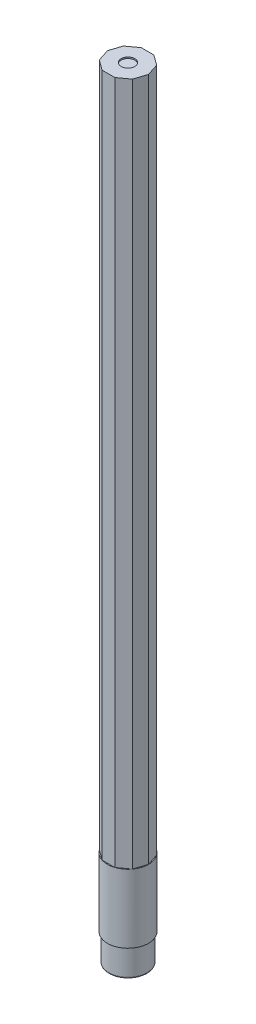
ISO-10303-21;
HEADER;
FILE_DESCRIPTION(('STEP AP214'),'2;1');
FILE_NAME('part.step','',(''),(''),'','','');
FILE_SCHEMA(('AUTOMOTIVE_DESIGN { 1 0 10303 214 1 1 1 1 }'));
ENDSEC;
DATA;
#1=APPLICATION_CONTEXT('core data for automotive mechanical design processes');
#2=APPLICATION_PROTOCOL_DEFINITION('international standard','automotive_design',2000,#1);
#3=PRODUCT_CONTEXT('',#1,'mechanical');
#4=PRODUCT('Part','Part','',(#3));
#5=PRODUCT_RELATED_PRODUCT_CATEGORY('part','',(#4));
#6=PRODUCT_DEFINITION_FORMATION('','',#4);
#7=PRODUCT_DEFINITION_CONTEXT('part definition',#1,'design');
#8=PRODUCT_DEFINITION('design','',#6,#7);
#9=PRODUCT_DEFINITION_SHAPE('','',#8);
#10=(LENGTH_UNIT() NAMED_UNIT(*) SI_UNIT(.MILLI.,.METRE.));
#11=(NAMED_UNIT(*) PLANE_ANGLE_UNIT() SI_UNIT($,.RADIAN.));
#12=(NAMED_UNIT(*) SI_UNIT($,.STERADIAN.) SOLID_ANGLE_UNIT());
#13=UNCERTAINTY_MEASURE_WITH_UNIT(LENGTH_MEASURE(1.E-05),#10,'distance_accuracy_value','');
#14=(GEOMETRIC_REPRESENTATION_CONTEXT(3) GLOBAL_UNCERTAINTY_ASSIGNED_CONTEXT((#13)) GLOBAL_UNIT_ASSIGNED_CONTEXT((#10,
#11,#12)) REPRESENTATION_CONTEXT('',''));
#15=CARTESIAN_POINT('',(0.,0.,0.));
#16=DIRECTION('',(0.,0.,1.));
#17=DIRECTION('',(1.,0.,0.));
#18=AXIS2_PLACEMENT_3D('',#15,#16,#17);
#19=CARTESIAN_POINT('',(0.,12.7,0.));
#20=DIRECTION('',(0.,1.,0.));
#21=DIRECTION('',(0.,0.,1.));
#22=AXIS2_PLACEMENT_3D('',#19,#20,#21);
#23=PLANE('',#22);
#24=DIRECTION('',(0.309016994374951,0.,-0.951056516295153));
#25=VECTOR('',#24,1.);
#26=CARTESIAN_POINT('',(3.08235474856854,12.7,2.23946181123433));
#27=LINE('',#26,#25);
#28=CARTESIAN_POINT('',(3.08235474856854,12.7,2.23946181123433));
#29=VERTEX_POINT('',#28);
#30=CARTESIAN_POINT('',(3.81,12.7,0.));
#31=VERTEX_POINT('',#30);
#32=EDGE_CURVE('E144',#29,#31,#27,.T.);
#33=ORIENTED_EDGE('',*,*,#32,.F.);
#34=CARTESIAN_POINT('',(0.,12.7,0.));
#35=DIRECTION('',(0.,1.,0.));
#36=DIRECTION('',(0.,0.,1.));
#37=AXIS2_PLACEMENT_3D('',#34,#35,#36);
#38=CIRCLE('',#37,3.81);
#39=EDGE_CURVE('E157',#29,#31,#38,.T.);
#40=ORIENTED_EDGE('',*,*,#39,.T.);
#41=EDGE_LOOP('',(#33,#40));
#42=FACE_BOUND('',#41,.T.);
#43=ADVANCED_FACE('F41',(#42),#23,.T.);
#44=DIRECTION('',(0.80901699437495,0.,-0.587785252292469));
#45=VECTOR('',#44,1.);
#46=CARTESIAN_POINT('',(1.17735474856854,12.7,3.62352532708453));
#47=LINE('',#46,#45);
#48=CARTESIAN_POINT('',(1.17735474856855,12.7,3.62352532708453));
#49=VERTEX_POINT('',#48);
#50=EDGE_CURVE('E141',#49,#29,#47,.T.);
#51=ORIENTED_EDGE('',*,*,#50,.F.);
#52=EDGE_CURVE('E154',#49,#29,#38,.T.);
#53=ORIENTED_EDGE('',*,*,#52,.T.);
#54=EDGE_LOOP('',(#51,#53));
#55=FACE_BOUND('',#54,.T.);
#56=ADVANCED_FACE('F252',(#55),#23,.T.);
#57=DIRECTION('',(1.,0.,0.));
#58=VECTOR('',#57,1.);
#59=CARTESIAN_POINT('',(-1.17735474856856,12.7,3.62352532708453));
#60=LINE('',#59,#58);
#61=CARTESIAN_POINT('',(-1.17735474856855,12.7,3.62352532708453));
#62=VERTEX_POINT('',#61);
#63=EDGE_CURVE('E55',#62,#49,#60,.T.);
#64=ORIENTED_EDGE('',*,*,#63,.F.);
#65=EDGE_CURVE('E148',#62,#49,#38,.T.);
#66=ORIENTED_EDGE('',*,*,#65,.T.);
#67=EDGE_LOOP('',(#64,#66));
#68=FACE_BOUND('',#67,.T.);
#69=ADVANCED_FACE('F257',(#68),#23,.T.);
#70=DIRECTION('',(0.809016994374947,0.,0.587785252292474));
#71=VECTOR('',#70,1.);
#72=CARTESIAN_POINT('',(-3.08235474856856,12.7,2.23946181123431));
#73=LINE('',#72,#71);
#74=CARTESIAN_POINT('',(-3.08235474856856,12.7,2.23946181123431));
#75=VERTEX_POINT('',#74);
#76=EDGE_CURVE('E62',#75,#62,#73,.T.);
#77=ORIENTED_EDGE('',*,*,#76,.F.);
#78=EDGE_CURVE('E291',#75,#62,#38,.T.);
#79=ORIENTED_EDGE('',*,*,#78,.T.);
#80=EDGE_LOOP('',(#77,#79));
#81=FACE_BOUND('',#80,.T.);
#82=ADVANCED_FACE('F503',(#81),#23,.T.);
#83=DIRECTION('',(0.309016994374945,0.,0.951056516295155));
#84=VECTOR('',#83,1.);
#85=CARTESIAN_POINT('',(-3.81,12.7,0.));
#86=LINE('',#85,#84);
#87=CARTESIAN_POINT('',(-3.81,12.7,0.));
#88=VERTEX_POINT('',#87);
#89=EDGE_CURVE('E200',#88,#75,#86,.T.);
#90=ORIENTED_EDGE('',*,*,#89,.F.);
#91=EDGE_CURVE('E288',#88,#75,#38,.T.);
#92=ORIENTED_EDGE('',*,*,#91,.T.);
#93=EDGE_LOOP('',(#90,#92));
#94=FACE_BOUND('',#93,.T.);
#95=ADVANCED_FACE('F512',(#94),#23,.T.);
#96=DIRECTION('',(-0.30901699437495,0.,0.951056516295153));
#97=VECTOR('',#96,1.);
#98=CARTESIAN_POINT('',(-3.08235474856854,12.7,-2.23946181123433));
#99=LINE('',#98,#97);
#100=CARTESIAN_POINT('',(-3.08235474856854,12.7,-2.23946181123433));
#101=VERTEX_POINT('',#100);
#102=EDGE_CURVE('E197',#101,#88,#99,.T.);
#103=ORIENTED_EDGE('',*,*,#102,.F.);
#104=EDGE_CURVE('E286',#101,#88,#38,.T.);
#105=ORIENTED_EDGE('',*,*,#104,.T.);
#106=EDGE_LOOP('',(#103,#105));
#107=FACE_BOUND('',#106,.T.);
#108=ADVANCED_FACE('F278',(#107),#23,.T.);
#109=DIRECTION('',(-0.80901699437495,0.,0.587785252292469));
#110=VECTOR('',#109,1.);
#111=CARTESIAN_POINT('',(-1.17735474856854,12.7,-3.62352532708453));
#112=LINE('',#111,#110);
#113=CARTESIAN_POINT('',(-1.17735474856855,12.7,-3.62352532708453));
#114=VERTEX_POINT('',#113);
#115=EDGE_CURVE('E194',#114,#101,#112,.T.);
#116=ORIENTED_EDGE('',*,*,#115,.F.);
#117=EDGE_CURVE('E285',#114,#101,#38,.T.);
#118=ORIENTED_EDGE('',*,*,#117,.T.);
#119=EDGE_LOOP('',(#116,#118));
#120=FACE_BOUND('',#119,.T.);
#121=ADVANCED_FACE('F273',(#120),#23,.T.);
#122=DIRECTION('',(-1.,0.,0.));
#123=VECTOR('',#122,1.);
#124=CARTESIAN_POINT('',(1.17735474856856,12.7,-3.62352532708453));
#125=LINE('',#124,#123);
#126=CARTESIAN_POINT('',(1.17735474856855,12.7,-3.62352532708453));
#127=VERTEX_POINT('',#126);
#128=EDGE_CURVE('E191',#127,#114,#125,.T.);
#129=ORIENTED_EDGE('',*,*,#128,.F.);
#130=EDGE_CURVE('E281',#127,#114,#38,.T.);
#131=ORIENTED_EDGE('',*,*,#130,.T.);
#132=EDGE_LOOP('',(#129,#131));
#133=FACE_BOUND('',#132,.T.);
#134=ADVANCED_FACE('F269',(#133),#23,.T.);
#135=DIRECTION('',(-0.809016994374946,0.,-0.587785252292475));
#136=VECTOR('',#135,1.);
#137=CARTESIAN_POINT('',(3.08235474856856,12.7,-2.23946181123431));
#138=LINE('',#137,#136);
#139=CARTESIAN_POINT('',(3.08235474856856,12.7,-2.23946181123431));
#140=VERTEX_POINT('',#139);
#141=EDGE_CURVE('E188',#140,#127,#138,.T.);
#142=ORIENTED_EDGE('',*,*,#141,.F.);
#143=EDGE_CURVE('E238',#140,#127,#38,.T.);
#144=ORIENTED_EDGE('',*,*,#143,.T.);
#145=EDGE_LOOP('',(#142,#144));
#146=FACE_BOUND('',#145,.T.);
#147=ADVANCED_FACE('F236',(#146),#23,.T.);
#148=CARTESIAN_POINT('',(0.,12.7,0.));
#149=DIRECTION('',(0.,-1.,0.));
#150=DIRECTION('',(0.,0.,-1.));
#151=AXIS2_PLACEMENT_3D('',#148,#149,#150);
#152=CYLINDRICAL_SURFACE('',#151,3.81);
#153=ORIENTED_EDGE('',*,*,#52,.F.);
#154=ORIENTED_EDGE('',*,*,#65,.F.);
#155=ORIENTED_EDGE('',*,*,#78,.F.);
#156=ORIENTED_EDGE('',*,*,#91,.F.);
#157=ORIENTED_EDGE('',*,*,#104,.F.);
#158=ORIENTED_EDGE('',*,*,#117,.F.);
#159=ORIENTED_EDGE('',*,*,#130,.F.);
#160=ORIENTED_EDGE('',*,*,#143,.F.);
#161=EDGE_CURVE('E242',#31,#140,#38,.T.);
#162=ORIENTED_EDGE('',*,*,#161,.F.);
#163=ORIENTED_EDGE('',*,*,#39,.F.);
#164=EDGE_LOOP('',(#153,#154,#155,#156,#157,#158,#159,#160,#162,#163));
#165=FACE_BOUND('',#164,.T.);
#166=CARTESIAN_POINT('',(0.,0.,0.));
#167=DIRECTION('',(0.,1.,0.));
#168=DIRECTION('',(0.,0.,1.));
#169=AXIS2_PLACEMENT_3D('',#166,#167,#168);
#170=CIRCLE('',#169,3.81);
#171=CARTESIAN_POINT('',(0.,0.,3.81));
#172=VERTEX_POINT('',#171);
#173=EDGE_CURVE('E145',#172,#172,#170,.T.);
#174=ORIENTED_EDGE('',*,*,#173,.T.);
#175=EDGE_LOOP('',(#174));
#176=FACE_BOUND('',#175,.T.);
#177=ADVANCED_FACE('F247',(#165,#176),#152,.T.);
#178=DIRECTION('',(-0.309016994374944,0.,-0.951056516295155));
#179=VECTOR('',#178,1.);
#180=CARTESIAN_POINT('',(3.81,12.7,0.));
#181=LINE('',#180,#179);
#182=EDGE_CURVE('E185',#31,#140,#181,.T.);
#183=ORIENTED_EDGE('',*,*,#182,.F.);
#184=ORIENTED_EDGE('',*,*,#161,.T.);
#185=EDGE_LOOP('',(#183,#184));
#186=FACE_BOUND('',#185,.T.);
#187=ADVANCED_FACE('F241',(#186),#23,.T.);
#188=CARTESIAN_POINT('',(0.,0.,0.));
#189=DIRECTION('',(0.,1.,0.));
#190=DIRECTION('',(0.,0.,1.));
#191=AXIS2_PLACEMENT_3D('',#188,#189,#190);
#192=PLANE('',#191);
#193=CARTESIAN_POINT('',(0.,0.,0.));
#194=DIRECTION('',(0.,-1.,0.));
#195=DIRECTION('',(0.,0.,-1.));
#196=AXIS2_PLACEMENT_3D('',#193,#194,#195);
#197=CIRCLE('',#196,3.556);
#198=CARTESIAN_POINT('',(0.,0.,-3.556));
#199=VERTEX_POINT('',#198);
#200=EDGE_CURVE('E156',#199,#199,#197,.T.);
#201=ORIENTED_EDGE('',*,*,#200,.F.);
#202=EDGE_LOOP('',(#201));
#203=FACE_BOUND('',#202,.T.);
#204=ORIENTED_EDGE('',*,*,#173,.F.);
#205=EDGE_LOOP('',(#204));
#206=FACE_BOUND('',#205,.T.);
#207=ADVANCED_FACE('F262',(#203,#206),#192,.F.);
#208=CARTESIAN_POINT('',(3.08235474856854,139.7,2.23946181123433));
#209=DIRECTION('',(-0.951056516295153,0.,-0.309016994374951));
#210=DIRECTION('',(-0.309016994374951,0.,0.951056516295153));
#211=AXIS2_PLACEMENT_3D('',#208,#209,#210);
#212=PLANE('',#211);
#213=ORIENTED_EDGE('',*,*,#32,.T.);
#214=DIRECTION('',(0.,-1.,0.));
#215=VECTOR('',#214,1.);
#216=CARTESIAN_POINT('',(3.81,139.7,0.));
#217=LINE('',#216,#215);
#218=CARTESIAN_POINT('',(3.81,139.7,0.));
#219=VERTEX_POINT('',#218);
#220=EDGE_CURVE('E125',#219,#31,#217,.T.);
#221=ORIENTED_EDGE('',*,*,#220,.F.);
#222=DIRECTION('',(0.309016994374951,0.,-0.951056516295153));
#223=VECTOR('',#222,1.);
#224=CARTESIAN_POINT('',(3.08235474856854,139.7,2.23946181123433));
#225=LINE('',#224,#223);
#226=CARTESIAN_POINT('',(3.08235474856854,139.7,2.23946181123433));
#227=VERTEX_POINT('',#226);
#228=EDGE_CURVE('E132',#227,#219,#225,.T.);
#229=ORIENTED_EDGE('',*,*,#228,.F.);
#230=DIRECTION('',(0.,-1.,0.));
#231=VECTOR('',#230,1.);
#232=CARTESIAN_POINT('',(3.08235474856854,139.7,2.23946181123433));
#233=LINE('',#232,#231);
#234=EDGE_CURVE('E183',#227,#29,#233,.T.);
#235=ORIENTED_EDGE('',*,*,#234,.T.);
#236=EDGE_LOOP('',(#213,#221,#229,#235));
#237=FACE_BOUND('',#236,.T.);
#238=ADVANCED_FACE('F143',(#237),#212,.F.);
#239=CARTESIAN_POINT('',(3.81,139.7,0.));
#240=DIRECTION('',(-0.951056516295155,0.,0.309016994374944));
#241=DIRECTION('',(0.309016994374944,0.,0.951056516295155));
#242=AXIS2_PLACEMENT_3D('',#239,#240,#241);
#243=PLANE('',#242);
#244=ORIENTED_EDGE('',*,*,#182,.T.);
#245=DIRECTION('',(0.,-1.,0.));
#246=VECTOR('',#245,1.);
#247=CARTESIAN_POINT('',(3.08235474856856,139.7,-2.23946181123431));
#248=LINE('',#247,#246);
#249=CARTESIAN_POINT('',(3.08235474856856,139.7,-2.23946181123431));
#250=VERTEX_POINT('',#249);
#251=EDGE_CURVE('E128',#250,#140,#248,.T.);
#252=ORIENTED_EDGE('',*,*,#251,.F.);
#253=DIRECTION('',(-0.309016994374944,0.,-0.951056516295155));
#254=VECTOR('',#253,1.);
#255=CARTESIAN_POINT('',(3.81,139.7,0.));
#256=LINE('',#255,#254);
#257=EDGE_CURVE('E120',#219,#250,#256,.T.);
#258=ORIENTED_EDGE('',*,*,#257,.F.);
#259=ORIENTED_EDGE('',*,*,#220,.T.);
#260=EDGE_LOOP('',(#244,#252,#258,#259));
#261=FACE_BOUND('',#260,.T.);
#262=ADVANCED_FACE('F123',(#261),#243,.F.);
#263=CARTESIAN_POINT('',(3.08235474856856,139.7,-2.23946181123431));
#264=DIRECTION('',(-0.587785252292475,0.,0.809016994374946));
#265=DIRECTION('',(0.809016994374946,0.,0.587785252292475));
#266=AXIS2_PLACEMENT_3D('',#263,#264,#265);
#267=PLANE('',#266);
#268=ORIENTED_EDGE('',*,*,#141,.T.);
#269=DIRECTION('',(0.,-1.,0.));
#270=VECTOR('',#269,1.);
#271=CARTESIAN_POINT('',(1.17735474856856,139.7,-3.62352532708453));
#272=LINE('',#271,#270);
#273=CARTESIAN_POINT('',(1.17735474856856,139.7,-3.62352532708453));
#274=VERTEX_POINT('',#273);
#275=EDGE_CURVE('E150',#274,#127,#272,.T.);
#276=ORIENTED_EDGE('',*,*,#275,.F.);
#277=DIRECTION('',(-0.809016994374946,0.,-0.587785252292475));
#278=VECTOR('',#277,1.);
#279=CARTESIAN_POINT('',(3.08235474856856,139.7,-2.23946181123431));
#280=LINE('',#279,#278);
#281=EDGE_CURVE('E131',#250,#274,#280,.T.);
#282=ORIENTED_EDGE('',*,*,#281,.F.);
#283=ORIENTED_EDGE('',*,*,#251,.T.);
#284=EDGE_LOOP('',(#268,#276,#282,#283));
#285=FACE_BOUND('',#284,.T.);
#286=ADVANCED_FACE('F232',(#285),#267,.F.);
#287=CARTESIAN_POINT('',(1.17735474856856,139.7,-3.62352532708453));
#288=DIRECTION('',(0.,0.,1.));
#289=DIRECTION('',(1.,0.,0.));
#290=AXIS2_PLACEMENT_3D('',#287,#288,#289);
#291=PLANE('',#290);
#292=ORIENTED_EDGE('',*,*,#128,.T.);
#293=DIRECTION('',(0.,-1.,0.));
#294=VECTOR('',#293,1.);
#295=CARTESIAN_POINT('',(-1.17735474856854,139.7,-3.62352532708453));
#296=LINE('',#295,#294);
#297=CARTESIAN_POINT('',(-1.17735474856854,139.7,-3.62352532708453));
#298=VERTEX_POINT('',#297);
#299=EDGE_CURVE('E223',#298,#114,#296,.T.);
#300=ORIENTED_EDGE('',*,*,#299,.F.);
#301=DIRECTION('',(-1.,0.,0.));
#302=VECTOR('',#301,1.);
#303=CARTESIAN_POINT('',(1.17735474856856,139.7,-3.62352532708453));
#304=LINE('',#303,#302);
#305=EDGE_CURVE('E170',#274,#298,#304,.T.);
#306=ORIENTED_EDGE('',*,*,#305,.F.);
#307=ORIENTED_EDGE('',*,*,#275,.T.);
#308=EDGE_LOOP('',(#292,#300,#306,#307));
#309=FACE_BOUND('',#308,.T.);
#310=ADVANCED_FACE('F229',(#309),#291,.F.);
#311=CARTESIAN_POINT('',(-1.17735474856854,139.7,-3.62352532708453));
#312=DIRECTION('',(0.587785252292469,0.,0.80901699437495));
#313=DIRECTION('',(0.80901699437495,0.,-0.587785252292469));
#314=AXIS2_PLACEMENT_3D('',#311,#312,#313);
#315=PLANE('',#314);
#316=ORIENTED_EDGE('',*,*,#115,.T.);
#317=DIRECTION('',(0.,-1.,0.));
#318=VECTOR('',#317,1.);
#319=CARTESIAN_POINT('',(-3.08235474856854,139.7,-2.23946181123433));
#320=LINE('',#319,#318);
#321=CARTESIAN_POINT('',(-3.08235474856854,139.7,-2.23946181123433));
#322=VERTEX_POINT('',#321);
#323=EDGE_CURVE('E220',#322,#101,#320,.T.);
#324=ORIENTED_EDGE('',*,*,#323,.F.);
#325=DIRECTION('',(-0.80901699437495,0.,0.587785252292469));
#326=VECTOR('',#325,1.);
#327=CARTESIAN_POINT('',(-1.17735474856854,139.7,-3.62352532708453));
#328=LINE('',#327,#326);
#329=EDGE_CURVE('E172',#298,#322,#328,.T.);
#330=ORIENTED_EDGE('',*,*,#329,.F.);
#331=ORIENTED_EDGE('',*,*,#299,.T.);
#332=EDGE_LOOP('',(#316,#324,#330,#331));
#333=FACE_BOUND('',#332,.T.);
#334=ADVANCED_FACE('F324',(#333),#315,.F.);
#335=CARTESIAN_POINT('',(-3.08235474856854,139.7,-2.23946181123433));
#336=DIRECTION('',(0.951056516295153,0.,0.30901699437495));
#337=DIRECTION('',(0.309016994374951,0.,-0.951056516295153));
#338=AXIS2_PLACEMENT_3D('',#335,#336,#337);
#339=PLANE('',#338);
#340=ORIENTED_EDGE('',*,*,#102,.T.);
#341=DIRECTION('',(0.,-1.,0.));
#342=VECTOR('',#341,1.);
#343=CARTESIAN_POINT('',(-3.81,139.7,0.));
#344=LINE('',#343,#342);
#345=CARTESIAN_POINT('',(-3.81,139.7,0.));
#346=VERTEX_POINT('',#345);
#347=EDGE_CURVE('E217',#346,#88,#344,.T.);
#348=ORIENTED_EDGE('',*,*,#347,.F.);
#349=DIRECTION('',(-0.30901699437495,0.,0.951056516295153));
#350=VECTOR('',#349,1.);
#351=CARTESIAN_POINT('',(-3.08235474856854,139.7,-2.23946181123433));
#352=LINE('',#351,#350);
#353=EDGE_CURVE('E174',#322,#346,#352,.T.);
#354=ORIENTED_EDGE('',*,*,#353,.F.);
#355=ORIENTED_EDGE('',*,*,#323,.T.);
#356=EDGE_LOOP('',(#340,#348,#354,#355));
#357=FACE_BOUND('',#356,.T.);
#358=ADVANCED_FACE('F320',(#357),#339,.F.);
#359=CARTESIAN_POINT('',(-3.81,139.7,0.));
#360=DIRECTION('',(0.951056516295155,0.,-0.309016994374944));
#361=DIRECTION('',(-0.309016994374944,0.,-0.951056516295155));
#362=AXIS2_PLACEMENT_3D('',#359,#360,#361);
#363=PLANE('',#362);
#364=ORIENTED_EDGE('',*,*,#89,.T.);
#365=DIRECTION('',(0.,-1.,0.));
#366=VECTOR('',#365,1.);
#367=CARTESIAN_POINT('',(-3.08235474856856,139.7,2.23946181123431));
#368=LINE('',#367,#366);
#369=CARTESIAN_POINT('',(-3.08235474856856,139.7,2.23946181123431));
#370=VERTEX_POINT('',#369);
#371=EDGE_CURVE('E214',#370,#75,#368,.T.);
#372=ORIENTED_EDGE('',*,*,#371,.F.);
#373=DIRECTION('',(0.309016994374945,0.,0.951056516295155));
#374=VECTOR('',#373,1.);
#375=CARTESIAN_POINT('',(-3.81,139.7,0.));
#376=LINE('',#375,#374);
#377=EDGE_CURVE('E176',#346,#370,#376,.T.);
#378=ORIENTED_EDGE('',*,*,#377,.F.);
#379=ORIENTED_EDGE('',*,*,#347,.T.);
#380=EDGE_LOOP('',(#364,#372,#378,#379));
#381=FACE_BOUND('',#380,.T.);
#382=ADVANCED_FACE('F316',(#381),#363,.F.);
#383=CARTESIAN_POINT('',(-3.08235474856856,139.7,2.23946181123431));
#384=DIRECTION('',(0.587785252292474,0.,-0.809016994374947));
#385=DIRECTION('',(-0.809016994374947,0.,-0.587785252292474));
#386=AXIS2_PLACEMENT_3D('',#383,#384,#385);
#387=PLANE('',#386);
#388=ORIENTED_EDGE('',*,*,#76,.T.);
#389=DIRECTION('',(0.,-1.,0.));
#390=VECTOR('',#389,1.);
#391=CARTESIAN_POINT('',(-1.17735474856856,139.7,3.62352532708453));
#392=LINE('',#391,#390);
#393=CARTESIAN_POINT('',(-1.17735474856856,139.7,3.62352532708453));
#394=VERTEX_POINT('',#393);
#395=EDGE_CURVE('E211',#394,#62,#392,.T.);
#396=ORIENTED_EDGE('',*,*,#395,.F.);
#397=DIRECTION('',(0.809016994374947,0.,0.587785252292474));
#398=VECTOR('',#397,1.);
#399=CARTESIAN_POINT('',(-3.08235474856856,139.7,2.23946181123431));
#400=LINE('',#399,#398);
#401=EDGE_CURVE('E178',#370,#394,#400,.T.);
#402=ORIENTED_EDGE('',*,*,#401,.F.);
#403=ORIENTED_EDGE('',*,*,#371,.T.);
#404=EDGE_LOOP('',(#388,#396,#402,#403));
#405=FACE_BOUND('',#404,.T.);
#406=ADVANCED_FACE('F310',(#405),#387,.F.);
#407=CARTESIAN_POINT('',(-1.17735474856856,139.7,3.62352532708453));
#408=DIRECTION('',(0.,0.,-1.));
#409=DIRECTION('',(-1.,0.,0.));
#410=AXIS2_PLACEMENT_3D('',#407,#408,#409);
#411=PLANE('',#410);
#412=ORIENTED_EDGE('',*,*,#63,.T.);
#413=DIRECTION('',(0.,-1.,0.));
#414=VECTOR('',#413,1.);
#415=CARTESIAN_POINT('',(1.17735474856854,139.7,3.62352532708453));
#416=LINE('',#415,#414);
#417=CARTESIAN_POINT('',(1.17735474856854,139.7,3.62352532708453));
#418=VERTEX_POINT('',#417);
#419=EDGE_CURVE('E208',#418,#49,#416,.T.);
#420=ORIENTED_EDGE('',*,*,#419,.F.);
#421=DIRECTION('',(1.,0.,0.));
#422=VECTOR('',#421,1.);
#423=CARTESIAN_POINT('',(-1.17735474856856,139.7,3.62352532708453));
#424=LINE('',#423,#422);
#425=EDGE_CURVE('E180',#394,#418,#424,.T.);
#426=ORIENTED_EDGE('',*,*,#425,.F.);
#427=ORIENTED_EDGE('',*,*,#395,.T.);
#428=EDGE_LOOP('',(#412,#420,#426,#427));
#429=FACE_BOUND('',#428,.T.);
#430=ADVANCED_FACE('F296',(#429),#411,.F.);
#431=CARTESIAN_POINT('',(1.17735474856854,139.7,3.62352532708453));
#432=DIRECTION('',(-0.587785252292469,0.,-0.80901699437495));
#433=DIRECTION('',(-0.80901699437495,0.,0.587785252292469));
#434=AXIS2_PLACEMENT_3D('',#431,#432,#433);
#435=PLANE('',#434);
#436=ORIENTED_EDGE('',*,*,#50,.T.);
#437=ORIENTED_EDGE('',*,*,#234,.F.);
#438=DIRECTION('',(0.80901699437495,0.,-0.587785252292469));
#439=VECTOR('',#438,1.);
#440=CARTESIAN_POINT('',(1.17735474856854,139.7,3.62352532708453));
#441=LINE('',#440,#439);
#442=EDGE_CURVE('E137',#418,#227,#441,.T.);
#443=ORIENTED_EDGE('',*,*,#442,.F.);
#444=ORIENTED_EDGE('',*,*,#419,.T.);
#445=EDGE_LOOP('',(#436,#437,#443,#444));
#446=FACE_BOUND('',#445,.T.);
#447=ADVANCED_FACE('F300',(#446),#435,.F.);
#448=CARTESIAN_POINT('',(0.,139.7,0.));
#449=DIRECTION('',(0.,1.,0.));
#450=DIRECTION('',(0.,0.,1.));
#451=AXIS2_PLACEMENT_3D('',#448,#449,#450);
#452=PLANE('',#451);
#453=CARTESIAN_POINT('',(0.,139.7,0.));
#454=DIRECTION('',(0.,1.,0.));
#455=DIRECTION('',(0.,0.,1.));
#456=AXIS2_PLACEMENT_3D('',#453,#454,#455);
#457=CIRCLE('',#456,1.27);
#458=CARTESIAN_POINT('',(0.,139.7,1.27));
#459=VERTEX_POINT('',#458);
#460=EDGE_CURVE('E166',#459,#459,#457,.T.);
#461=ORIENTED_EDGE('',*,*,#460,.F.);
#462=EDGE_LOOP('',(#461));
#463=FACE_BOUND('',#462,.T.);
#464=ORIENTED_EDGE('',*,*,#228,.T.);
#465=ORIENTED_EDGE('',*,*,#257,.T.);
#466=ORIENTED_EDGE('',*,*,#281,.T.);
#467=ORIENTED_EDGE('',*,*,#305,.T.);
#468=ORIENTED_EDGE('',*,*,#329,.T.);
#469=ORIENTED_EDGE('',*,*,#353,.T.);
#470=ORIENTED_EDGE('',*,*,#377,.T.);
#471=ORIENTED_EDGE('',*,*,#401,.T.);
#472=ORIENTED_EDGE('',*,*,#425,.T.);
#473=ORIENTED_EDGE('',*,*,#442,.T.);
#474=EDGE_LOOP('',(#464,#465,#466,#467,#468,#469,#470,#471,#472,#473));
#475=FACE_BOUND('',#474,.T.);
#476=ADVANCED_FACE('F135',(#463,#475),#452,.T.);
#477=CARTESIAN_POINT('',(0.,-5.08,0.));
#478=DIRECTION('',(0.,1.,0.));
#479=DIRECTION('',(0.,0.,1.));
#480=AXIS2_PLACEMENT_3D('',#477,#478,#479);
#481=CYLINDRICAL_SURFACE('',#480,3.556);
#482=CARTESIAN_POINT('',(0.,-4.826,0.));
#483=DIRECTION('',(0.,-1.,0.));
#484=DIRECTION('',(0.,0.,-1.));
#485=AXIS2_PLACEMENT_3D('',#482,#483,#484);
#486=CIRCLE('',#485,3.556);
#487=CARTESIAN_POINT('',(0.,-4.826,-3.556));
#488=VERTEX_POINT('',#487);
#489=EDGE_CURVE('E11',#488,#488,#486,.F.);
#490=ORIENTED_EDGE('',*,*,#489,.T.);
#491=EDGE_LOOP('',(#490));
#492=FACE_BOUND('',#491,.T.);
#493=ORIENTED_EDGE('',*,*,#200,.T.);
#494=EDGE_LOOP('',(#493));
#495=FACE_BOUND('',#494,.T.);
#496=ADVANCED_FACE('F307',(#492,#495),#481,.T.);
#497=CARTESIAN_POINT('',(0.,-5.08,0.));
#498=DIRECTION('',(0.,-1.,0.));
#499=DIRECTION('',(0.,0.,-1.));
#500=AXIS2_PLACEMENT_3D('',#497,#498,#499);
#501=PLANE('',#500);
#502=CARTESIAN_POINT('',(0.,-5.08,0.));
#503=DIRECTION('',(0.,-1.,0.));
#504=DIRECTION('',(0.,0.,-1.));
#505=AXIS2_PLACEMENT_3D('',#502,#503,#504);
#506=CIRCLE('',#505,3.302);
#507=CARTESIAN_POINT('',(0.,-5.08,-3.302));
#508=VERTEX_POINT('',#507);
#509=EDGE_CURVE('E49',#508,#508,#506,.T.);
#510=ORIENTED_EDGE('',*,*,#509,.T.);
#511=EDGE_LOOP('',(#510));
#512=FACE_BOUND('',#511,.T.);
#513=ADVANCED_FACE('F394',(#512),#501,.T.);
#514=CARTESIAN_POINT('',(0.,-4.826,0.));
#515=DIRECTION('',(0.,-1.,0.));
#516=DIRECTION('',(0.,0.,-1.));
#517=AXIS2_PLACEMENT_3D('',#514,#515,#516);
#518=TOROIDAL_SURFACE('',#517,3.302,0.254);
#519=ORIENTED_EDGE('',*,*,#489,.F.);
#520=EDGE_LOOP('',(#519));
#521=FACE_BOUND('',#520,.T.);
#522=ORIENTED_EDGE('',*,*,#509,.F.);
#523=EDGE_LOOP('',(#522));
#524=FACE_BOUND('',#523,.T.);
#525=ADVANCED_FACE('F43',(#521,#524),#518,.T.);
#526=CARTESIAN_POINT('',(0.,139.446,0.));
#527=DIRECTION('',(0.,1.,0.));
#528=DIRECTION('',(0.,0.,1.));
#529=AXIS2_PLACEMENT_3D('',#526,#527,#528);
#530=CYLINDRICAL_SURFACE('',#529,1.27);
#531=CARTESIAN_POINT('',(0.,139.446,0.));
#532=DIRECTION('',(0.,1.,0.));
#533=DIRECTION('',(0.,0.,1.));
#534=AXIS2_PLACEMENT_3D('',#531,#532,#533);
#535=CIRCLE('',#534,1.27);
#536=CARTESIAN_POINT('',(0.,139.446,1.27));
#537=VERTEX_POINT('',#536);
#538=EDGE_CURVE('E186',#537,#537,#535,.T.);
#539=ORIENTED_EDGE('',*,*,#538,.F.);
#540=EDGE_LOOP('',(#539));
#541=FACE_BOUND('',#540,.T.);
#542=ORIENTED_EDGE('',*,*,#460,.T.);
#543=EDGE_LOOP('',(#542));
#544=FACE_BOUND('',#543,.T.);
#545=ADVANCED_FACE('F413',(#541,#544),#530,.F.);
#546=CARTESIAN_POINT('',(0.,139.446,0.));
#547=DIRECTION('',(0.,1.,0.));
#548=DIRECTION('',(0.,0.,1.));
#549=AXIS2_PLACEMENT_3D('',#546,#547,#548);
#550=PLANE('',#549);
#551=ORIENTED_EDGE('',*,*,#538,.T.);
#552=EDGE_LOOP('',(#551));
#553=FACE_BOUND('',#552,.T.);
#554=ADVANCED_FACE('F429',(#553),#550,.T.);
#555=CLOSED_SHELL('',(#43,#56,#69,#82,#95,#108,#121,#134,#147,#177,#187,#207,#238,#262,#286,
#310,#334,#358,#382,#406,#430,#447,#476,#496,#513,#525,#545,#554));
#556=MANIFOLD_SOLID_BREP('B2',#555);
#557=ADVANCED_BREP_SHAPE_REPRESENTATION('',(#18,#556),#14);
#558=SHAPE_DEFINITION_REPRESENTATION(#9,#557);
ENDSEC;
END-ISO-10303-21;
